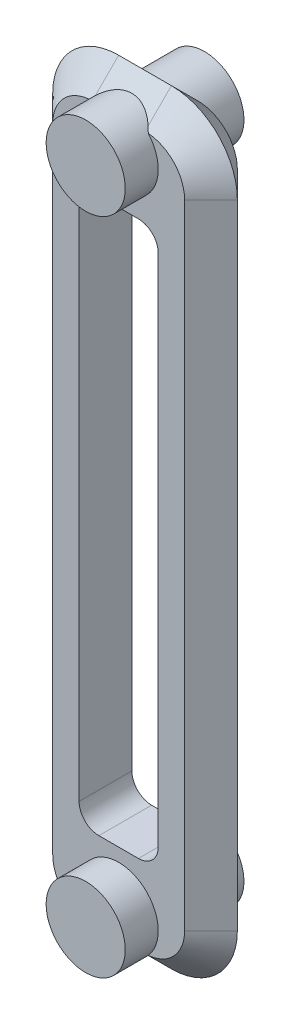
ISO-10303-21;
HEADER;
FILE_DESCRIPTION(('STEP AP214'),'2;1');
FILE_NAME('part.step','',(''),(''),'','','');
FILE_SCHEMA(('AUTOMOTIVE_DESIGN { 1 0 10303 214 1 1 1 1 }'));
ENDSEC;
DATA;
#1=APPLICATION_CONTEXT('core data for automotive mechanical design processes');
#2=APPLICATION_PROTOCOL_DEFINITION('international standard','automotive_design',2000,#1);
#3=PRODUCT_CONTEXT('',#1,'mechanical');
#4=PRODUCT('Part','Part','',(#3));
#5=PRODUCT_RELATED_PRODUCT_CATEGORY('part','',(#4));
#6=PRODUCT_DEFINITION_FORMATION('','',#4);
#7=PRODUCT_DEFINITION_CONTEXT('part definition',#1,'design');
#8=PRODUCT_DEFINITION('design','',#6,#7);
#9=PRODUCT_DEFINITION_SHAPE('','',#8);
#10=(LENGTH_UNIT() NAMED_UNIT(*) SI_UNIT(.MILLI.,.METRE.));
#11=(NAMED_UNIT(*) PLANE_ANGLE_UNIT() SI_UNIT($,.RADIAN.));
#12=(NAMED_UNIT(*) SI_UNIT($,.STERADIAN.) SOLID_ANGLE_UNIT());
#13=UNCERTAINTY_MEASURE_WITH_UNIT(LENGTH_MEASURE(1.E-05),#10,'distance_accuracy_value','');
#14=(GEOMETRIC_REPRESENTATION_CONTEXT(3) GLOBAL_UNCERTAINTY_ASSIGNED_CONTEXT((#13)) GLOBAL_UNIT_ASSIGNED_CONTEXT((#10,
#11,#12)) REPRESENTATION_CONTEXT('',''));
#15=CARTESIAN_POINT('',(0.,0.,0.));
#16=DIRECTION('',(0.,0.,1.));
#17=DIRECTION('',(1.,0.,0.));
#18=AXIS2_PLACEMENT_3D('',#15,#16,#17);
#19=CARTESIAN_POINT('',(0.,0.,-20.));
#20=DIRECTION('',(0.,0.,-1.));
#21=DIRECTION('',(-1.,0.,0.));
#22=AXIS2_PLACEMENT_3D('',#19,#20,#21);
#23=PLANE('',#22);
#24=CARTESIAN_POINT('',(0.,-458.783389552814,-20.));
#25=DIRECTION('',(0.,0.,-1.));
#26=DIRECTION('',(-1.,0.,0.));
#27=AXIS2_PLACEMENT_3D('',#24,#25,#26);
#28=CIRCLE('',#27,30.);
#29=CARTESIAN_POINT('',(-22.4498995979889,-478.683188748791,-20.));
#30=VERTEX_POINT('',#29);
#31=CARTESIAN_POINT('',(22.4498995979889,-478.683188748791,-20.));
#32=VERTEX_POINT('',#31);
#33=EDGE_CURVE('E494',#30,#32,#28,.T.);
#34=ORIENTED_EDGE('',*,*,#33,.F.);
#35=CARTESIAN_POINT('',(-20.,-448.783389552814,-20.));
#36=DIRECTION('',(0.,0.,-1.));
#37=DIRECTION('',(-1.,0.,0.));
#38=AXIS2_PLACEMENT_3D('',#35,#36,#37);
#39=CIRCLE('',#38,29.9999999999999);
#40=CARTESIAN_POINT('',(-49.9999999999999,-448.783389552814,-20.));
#41=VERTEX_POINT('',#40);
#42=EDGE_CURVE('E555',#30,#41,#39,.T.);
#43=ORIENTED_EDGE('',*,*,#42,.T.);
#44=DIRECTION('',(0.,1.,0.));
#45=VECTOR('',#44,1.);
#46=CARTESIAN_POINT('',(-49.9999999999999,31.2166104471865,-20.));
#47=LINE('',#46,#45);
#48=CARTESIAN_POINT('',(-49.9999999999999,31.2166104471865,-20.));
#49=VERTEX_POINT('',#48);
#50=EDGE_CURVE('E553',#41,#49,#47,.T.);
#51=ORIENTED_EDGE('',*,*,#50,.T.);
#52=CARTESIAN_POINT('',(-20.,31.2166104471865,-20.));
#53=DIRECTION('',(0.,0.,-1.));
#54=DIRECTION('',(-1.,0.,0.));
#55=AXIS2_PLACEMENT_3D('',#52,#53,#54);
#56=CIRCLE('',#55,29.9999999999999);
#57=CARTESIAN_POINT('',(-22.4498995979889,61.1164096431638,-20.));
#58=VERTEX_POINT('',#57);
#59=EDGE_CURVE('E551',#49,#58,#56,.T.);
#60=ORIENTED_EDGE('',*,*,#59,.T.);
#61=CARTESIAN_POINT('',(0.,41.2166104471865,-20.));
#62=DIRECTION('',(0.,0.,-1.));
#63=DIRECTION('',(-1.,0.,0.));
#64=AXIS2_PLACEMENT_3D('',#61,#62,#63);
#65=CIRCLE('',#64,30.);
#66=CARTESIAN_POINT('',(22.4498995979889,61.1164096431638,-20.));
#67=VERTEX_POINT('',#66);
#68=EDGE_CURVE('E503',#67,#58,#65,.T.);
#69=ORIENTED_EDGE('',*,*,#68,.F.);
#70=CARTESIAN_POINT('',(20.,31.2166104471865,-20.));
#71=DIRECTION('',(0.,0.,-1.));
#72=DIRECTION('',(-1.,0.,0.));
#73=AXIS2_PLACEMENT_3D('',#70,#71,#72);
#74=CIRCLE('',#73,29.9999999999999);
#75=CARTESIAN_POINT('',(49.9999999999999,31.2166104471865,-20.));
#76=VERTEX_POINT('',#75);
#77=EDGE_CURVE('E545',#67,#76,#74,.T.);
#78=ORIENTED_EDGE('',*,*,#77,.T.);
#79=DIRECTION('',(0.,-1.,0.));
#80=VECTOR('',#79,1.);
#81=CARTESIAN_POINT('',(49.9999999999999,-448.783389552814,-20.));
#82=LINE('',#81,#80);
#83=CARTESIAN_POINT('',(49.9999999999999,-448.783389552814,-20.));
#84=VERTEX_POINT('',#83);
#85=EDGE_CURVE('E547',#76,#84,#82,.T.);
#86=ORIENTED_EDGE('',*,*,#85,.T.);
#87=CARTESIAN_POINT('',(20.,-448.783389552814,-20.));
#88=DIRECTION('',(0.,0.,-1.));
#89=DIRECTION('',(-1.,0.,0.));
#90=AXIS2_PLACEMENT_3D('',#87,#88,#89);
#91=CIRCLE('',#90,29.9999999999999);
#92=EDGE_CURVE('E549',#84,#32,#91,.T.);
#93=ORIENTED_EDGE('',*,*,#92,.T.);
#94=EDGE_LOOP('',(#34,#43,#51,#60,#69,#78,#86,#93));
#95=FACE_BOUND('',#94,.T.);
#96=DIRECTION('',(1.,0.,0.));
#97=VECTOR('',#96,1.);
#98=CARTESIAN_POINT('',(0.,-418.783389552813,-20.));
#99=LINE('',#98,#97);
#100=CARTESIAN_POINT('',(-15.,-418.783389552813,-20.));
#101=VERTEX_POINT('',#100);
#102=CARTESIAN_POINT('',(15.,-418.783389552813,-20.));
#103=VERTEX_POINT('',#102);
#104=EDGE_CURVE('E477',#101,#103,#99,.T.);
#105=ORIENTED_EDGE('',*,*,#104,.T.);
#106=CARTESIAN_POINT('',(15.,-403.783389552813,-20.));
#107=DIRECTION('',(0.,0.,-1.));
#108=DIRECTION('',(-1.,0.,0.));
#109=AXIS2_PLACEMENT_3D('',#106,#107,#108);
#110=CIRCLE('',#109,15.);
#111=CARTESIAN_POINT('',(30.,-403.783389552813,-20.));
#112=VERTEX_POINT('',#111);
#113=EDGE_CURVE('E534',#103,#112,#110,.F.);
#114=ORIENTED_EDGE('',*,*,#113,.T.);
#115=DIRECTION('',(0.,1.,0.));
#116=VECTOR('',#115,1.);
#117=CARTESIAN_POINT('',(30.,0.,-20.));
#118=LINE('',#117,#116);
#119=CARTESIAN_POINT('',(30.,-13.7833895528135,-20.));
#120=VERTEX_POINT('',#119);
#121=EDGE_CURVE('E473',#112,#120,#118,.T.);
#122=ORIENTED_EDGE('',*,*,#121,.T.);
#123=CARTESIAN_POINT('',(15.,-13.7833895528135,-20.));
#124=DIRECTION('',(0.,0.,-1.));
#125=DIRECTION('',(-1.,0.,0.));
#126=AXIS2_PLACEMENT_3D('',#123,#124,#125);
#127=CIRCLE('',#126,15.);
#128=CARTESIAN_POINT('',(15.,1.21661044718652,-20.));
#129=VERTEX_POINT('',#128);
#130=EDGE_CURVE('E538',#120,#129,#127,.F.);
#131=ORIENTED_EDGE('',*,*,#130,.T.);
#132=DIRECTION('',(-1.,0.,0.));
#133=VECTOR('',#132,1.);
#134=CARTESIAN_POINT('',(0.,1.21661044718652,-20.));
#135=LINE('',#134,#133);
#136=CARTESIAN_POINT('',(-15.,1.21661044718652,-20.));
#137=VERTEX_POINT('',#136);
#138=EDGE_CURVE('E470',#129,#137,#135,.T.);
#139=ORIENTED_EDGE('',*,*,#138,.T.);
#140=CARTESIAN_POINT('',(-15.,-13.7833895528135,-20.));
#141=DIRECTION('',(0.,0.,-1.));
#142=DIRECTION('',(-1.,0.,0.));
#143=AXIS2_PLACEMENT_3D('',#140,#141,#142);
#144=CIRCLE('',#143,15.);
#145=CARTESIAN_POINT('',(-30.,-13.7833895528135,-20.));
#146=VERTEX_POINT('',#145);
#147=EDGE_CURVE('E150',#137,#146,#144,.F.);
#148=ORIENTED_EDGE('',*,*,#147,.T.);
#149=DIRECTION('',(0.,-1.,0.));
#150=VECTOR('',#149,1.);
#151=CARTESIAN_POINT('',(-30.,0.,-20.));
#152=LINE('',#151,#150);
#153=CARTESIAN_POINT('',(-30.,-403.783389552813,-20.));
#154=VERTEX_POINT('',#153);
#155=EDGE_CURVE('E485',#146,#154,#152,.T.);
#156=ORIENTED_EDGE('',*,*,#155,.T.);
#157=CARTESIAN_POINT('',(-15.,-403.783389552813,-20.));
#158=DIRECTION('',(0.,0.,-1.));
#159=DIRECTION('',(-1.,0.,0.));
#160=AXIS2_PLACEMENT_3D('',#157,#158,#159);
#161=CIRCLE('',#160,15.);
#162=EDGE_CURVE('E530',#154,#101,#161,.F.);
#163=ORIENTED_EDGE('',*,*,#162,.T.);
#164=EDGE_LOOP('',(#105,#114,#122,#131,#139,#148,#156,#163));
#165=FACE_BOUND('',#164,.T.);
#166=ADVANCED_FACE('F94',(#95,#165),#23,.T.);
#167=CARTESIAN_POINT('',(0.,0.,20.));
#168=DIRECTION('',(0.,0.,-1.));
#169=DIRECTION('',(-1.,0.,0.));
#170=AXIS2_PLACEMENT_3D('',#167,#168,#169);
#171=PLANE('',#170);
#172=CARTESIAN_POINT('',(0.,-458.783389552814,20.));
#173=DIRECTION('',(0.,0.,1.));
#174=DIRECTION('',(1.,0.,0.));
#175=AXIS2_PLACEMENT_3D('',#172,#173,#174);
#176=CIRCLE('',#175,30.);
#177=CARTESIAN_POINT('',(22.4498995979891,-478.683188748791,20.));
#178=VERTEX_POINT('',#177);
#179=CARTESIAN_POINT('',(-22.4498995979891,-478.683188748791,20.));
#180=VERTEX_POINT('',#179);
#181=EDGE_CURVE('E269',#178,#180,#176,.T.);
#182=ORIENTED_EDGE('',*,*,#181,.F.);
#183=CARTESIAN_POINT('',(20.,-448.783389552814,20.));
#184=DIRECTION('',(0.,0.,-1.));
#185=DIRECTION('',(-1.,0.,0.));
#186=AXIS2_PLACEMENT_3D('',#183,#184,#185);
#187=CIRCLE('',#186,29.9999999999997);
#188=CARTESIAN_POINT('',(49.9999999999997,-448.783389552814,20.));
#189=VERTEX_POINT('',#188);
#190=EDGE_CURVE('E567',#178,#189,#187,.F.);
#191=ORIENTED_EDGE('',*,*,#190,.T.);
#192=DIRECTION('',(0.,1.,0.));
#193=VECTOR('',#192,1.);
#194=CARTESIAN_POINT('',(49.9999999999997,0.,20.));
#195=LINE('',#194,#193);
#196=CARTESIAN_POINT('',(49.9999999999997,31.2166104471865,20.));
#197=VERTEX_POINT('',#196);
#198=EDGE_CURVE('E565',#189,#197,#195,.T.);
#199=ORIENTED_EDGE('',*,*,#198,.T.);
#200=CARTESIAN_POINT('',(20.,31.2166104471865,20.));
#201=DIRECTION('',(0.,0.,-1.));
#202=DIRECTION('',(-1.,0.,0.));
#203=AXIS2_PLACEMENT_3D('',#200,#201,#202);
#204=CIRCLE('',#203,29.9999999999997);
#205=CARTESIAN_POINT('',(22.4498995979891,61.1164096431636,20.));
#206=VERTEX_POINT('',#205);
#207=EDGE_CURVE('E563',#197,#206,#204,.F.);
#208=ORIENTED_EDGE('',*,*,#207,.T.);
#209=CARTESIAN_POINT('',(0.,41.2166104471865,20.));
#210=DIRECTION('',(0.,0.,1.));
#211=DIRECTION('',(1.,0.,0.));
#212=AXIS2_PLACEMENT_3D('',#209,#210,#211);
#213=CIRCLE('',#212,30.);
#214=CARTESIAN_POINT('',(-22.4498995979891,61.1164096431636,20.));
#215=VERTEX_POINT('',#214);
#216=EDGE_CURVE('E507',#215,#206,#213,.T.);
#217=ORIENTED_EDGE('',*,*,#216,.F.);
#218=CARTESIAN_POINT('',(-20.,31.2166104471865,20.));
#219=DIRECTION('',(0.,0.,-1.));
#220=DIRECTION('',(-1.,0.,0.));
#221=AXIS2_PLACEMENT_3D('',#218,#219,#220);
#222=CIRCLE('',#221,29.9999999999997);
#223=CARTESIAN_POINT('',(-49.9999999999997,31.2166104471865,20.));
#224=VERTEX_POINT('',#223);
#225=EDGE_CURVE('E557',#215,#224,#222,.F.);
#226=ORIENTED_EDGE('',*,*,#225,.T.);
#227=DIRECTION('',(0.,-1.,0.));
#228=VECTOR('',#227,1.);
#229=CARTESIAN_POINT('',(-49.9999999999997,0.,20.));
#230=LINE('',#229,#228);
#231=CARTESIAN_POINT('',(-49.9999999999997,-448.783389552814,20.));
#232=VERTEX_POINT('',#231);
#233=EDGE_CURVE('E559',#224,#232,#230,.T.);
#234=ORIENTED_EDGE('',*,*,#233,.T.);
#235=CARTESIAN_POINT('',(-20.,-448.783389552814,20.));
#236=DIRECTION('',(0.,0.,-1.));
#237=DIRECTION('',(-1.,0.,0.));
#238=AXIS2_PLACEMENT_3D('',#235,#236,#237);
#239=CIRCLE('',#238,29.9999999999996);
#240=EDGE_CURVE('E561',#232,#180,#239,.F.);
#241=ORIENTED_EDGE('',*,*,#240,.T.);
#242=EDGE_LOOP('',(#182,#191,#199,#208,#217,#226,#234,#241));
#243=FACE_BOUND('',#242,.T.);
#244=DIRECTION('',(-1.,0.,0.));
#245=VECTOR('',#244,1.);
#246=CARTESIAN_POINT('',(0.,1.21661044718652,20.));
#247=LINE('',#246,#245);
#248=CARTESIAN_POINT('',(15.,1.21661044718652,20.));
#249=VERTEX_POINT('',#248);
#250=CARTESIAN_POINT('',(-15.,1.21661044718652,20.));
#251=VERTEX_POINT('',#250);
#252=EDGE_CURVE('E487',#249,#251,#247,.T.);
#253=ORIENTED_EDGE('',*,*,#252,.F.);
#254=CARTESIAN_POINT('',(15.,-13.7833895528135,20.));
#255=DIRECTION('',(0.,0.,-1.));
#256=DIRECTION('',(-1.,0.,0.));
#257=AXIS2_PLACEMENT_3D('',#254,#255,#256);
#258=CIRCLE('',#257,15.);
#259=CARTESIAN_POINT('',(30.,-13.7833895528135,20.));
#260=VERTEX_POINT('',#259);
#261=EDGE_CURVE('E540',#249,#260,#258,.T.);
#262=ORIENTED_EDGE('',*,*,#261,.T.);
#263=DIRECTION('',(0.,1.,0.));
#264=VECTOR('',#263,1.);
#265=CARTESIAN_POINT('',(30.,0.,20.));
#266=LINE('',#265,#264);
#267=CARTESIAN_POINT('',(30.,-403.783389552813,20.));
#268=VERTEX_POINT('',#267);
#269=EDGE_CURVE('E928',#268,#260,#266,.T.);
#270=ORIENTED_EDGE('',*,*,#269,.F.);
#271=CARTESIAN_POINT('',(15.,-403.783389552813,20.));
#272=DIRECTION('',(0.,0.,-1.));
#273=DIRECTION('',(-1.,0.,0.));
#274=AXIS2_PLACEMENT_3D('',#271,#272,#273);
#275=CIRCLE('',#274,15.);
#276=CARTESIAN_POINT('',(15.,-418.783389552813,20.));
#277=VERTEX_POINT('',#276);
#278=EDGE_CURVE('E536',#268,#277,#275,.T.);
#279=ORIENTED_EDGE('',*,*,#278,.T.);
#280=DIRECTION('',(1.,0.,0.));
#281=VECTOR('',#280,1.);
#282=CARTESIAN_POINT('',(0.,-418.783389552813,20.));
#283=LINE('',#282,#281);
#284=CARTESIAN_POINT('',(-15.,-418.783389552813,20.));
#285=VERTEX_POINT('',#284);
#286=EDGE_CURVE('E940',#285,#277,#283,.T.);
#287=ORIENTED_EDGE('',*,*,#286,.F.);
#288=CARTESIAN_POINT('',(-15.,-403.783389552813,20.));
#289=DIRECTION('',(0.,0.,-1.));
#290=DIRECTION('',(-1.,0.,0.));
#291=AXIS2_PLACEMENT_3D('',#288,#289,#290);
#292=CIRCLE('',#291,15.);
#293=CARTESIAN_POINT('',(-30.,-403.783389552813,20.));
#294=VERTEX_POINT('',#293);
#295=EDGE_CURVE('E532',#285,#294,#292,.T.);
#296=ORIENTED_EDGE('',*,*,#295,.T.);
#297=DIRECTION('',(0.,-1.,0.));
#298=VECTOR('',#297,1.);
#299=CARTESIAN_POINT('',(-30.,0.,20.));
#300=LINE('',#299,#298);
#301=CARTESIAN_POINT('',(-30.,-13.7833895528135,20.));
#302=VERTEX_POINT('',#301);
#303=EDGE_CURVE('E480',#302,#294,#300,.T.);
#304=ORIENTED_EDGE('',*,*,#303,.F.);
#305=CARTESIAN_POINT('',(-15.,-13.7833895528135,20.));
#306=DIRECTION('',(0.,0.,-1.));
#307=DIRECTION('',(-1.,0.,0.));
#308=AXIS2_PLACEMENT_3D('',#305,#306,#307);
#309=CIRCLE('',#308,15.);
#310=EDGE_CURVE('E543',#302,#251,#309,.T.);
#311=ORIENTED_EDGE('',*,*,#310,.T.);
#312=EDGE_LOOP('',(#253,#262,#270,#279,#287,#296,#304,#311));
#313=FACE_BOUND('',#312,.T.);
#314=ADVANCED_FACE('F373',(#243,#313),#171,.F.);
#315=CARTESIAN_POINT('',(0.,41.2166104471865,45.));
#316=DIRECTION('',(0.,0.,-1.));
#317=DIRECTION('',(-1.,0.,0.));
#318=AXIS2_PLACEMENT_3D('',#315,#316,#317);
#319=PLANE('',#318);
#320=CARTESIAN_POINT('',(0.,41.2166104471865,45.));
#321=DIRECTION('',(0.,0.,-1.));
#322=DIRECTION('',(-1.,0.,0.));
#323=AXIS2_PLACEMENT_3D('',#320,#321,#322);
#324=CIRCLE('',#323,30.);
#325=CARTESIAN_POINT('',(-30.,41.2166104471865,45.));
#326=VERTEX_POINT('',#325);
#327=EDGE_CURVE('E500',#326,#326,#324,.T.);
#328=ORIENTED_EDGE('',*,*,#327,.F.);
#329=EDGE_LOOP('',(#328));
#330=FACE_BOUND('',#329,.T.);
#331=ADVANCED_FACE('F379',(#330),#319,.F.);
#332=CARTESIAN_POINT('',(0.,41.2166104471865,45.));
#333=DIRECTION('',(0.,0.,-1.));
#334=DIRECTION('',(-1.,0.,0.));
#335=AXIS2_PLACEMENT_3D('',#332,#333,#334);
#336=CYLINDRICAL_SURFACE('',#335,30.);
#337=ORIENTED_EDGE('',*,*,#327,.T.);
#338=EDGE_LOOP('',(#337));
#339=FACE_BOUND('',#338,.T.);
#340=CARTESIAN_POINT('',(22.4498995979891,61.1164096431636,20.));
#341=CARTESIAN_POINT('',(22.2588779635971,61.3319109296127,19.8008178010276));
#342=CARTESIAN_POINT('',(22.0644933278189,61.5449534858444,19.6021982180622));
#343=CARTESIAN_POINT('',(21.6692082579715,61.9657958840661,19.2062581488737));
#344=CARTESIAN_POINT('',(21.4683117448903,62.1735987517579,19.0089369639024));
#345=CARTESIAN_POINT('',(21.0599858906984,62.5838929599514,18.6155307991166));
#346=CARTESIAN_POINT('',(20.8525565145246,62.7863842719343,18.4194458259438));
#347=CARTESIAN_POINT('',(20.4311432071252,63.1859700238539,18.0284546150434));
#348=CARTESIAN_POINT('',(20.2171554702689,63.3830611996358,17.8335491434074));
#349=CARTESIAN_POINT('',(20.,63.5772902221844,17.6393202250018));
#350=B_SPLINE_CURVE_WITH_KNOTS('',3,(#340,#341,#342,#343,#344,#345,#346,#347,#348,#349),
.UNSPECIFIED.,.F.,.F.,(4,2,2,2,4),(0.,1.05042075361132,2.10022035721551,3.15002559624489,
4.20045199228863),.UNSPECIFIED.);
#351=CARTESIAN_POINT('',(20.,63.5772902221844,17.6393202250018));
#352=VERTEX_POINT('',#351);
#353=EDGE_CURVE('E272',#206,#352,#350,.T.);
#354=ORIENTED_EDGE('',*,*,#353,.T.);
#355=CARTESIAN_POINT('',(0.,41.2166104471865,39.9999999999994));
#356=DIRECTION('',(0.,0.707106781186544,0.707106781186551));
#357=DIRECTION('',(0.,0.707106781186551,-0.707106781186544));
#358=AXIS2_PLACEMENT_3D('',#355,#356,#357);
#359=ELLIPSE('',#358,42.4264068711926,30.);
#360=CARTESIAN_POINT('',(-20.,63.5772902221844,17.6393202250018));
#361=VERTEX_POINT('',#360);
#362=EDGE_CURVE('E12',#352,#361,#359,.T.);
#363=ORIENTED_EDGE('',*,*,#362,.T.);
#364=CARTESIAN_POINT('',(-20.,63.5772902221844,17.6393202250018));
#365=CARTESIAN_POINT('',(-20.2171554702689,63.3830611996358,17.8335491434074));
#366=CARTESIAN_POINT('',(-20.4311432071252,63.1859700238539,18.0284546150434));
#367=CARTESIAN_POINT('',(-20.8525565145246,62.7863842719343,18.4194458259438));
#368=CARTESIAN_POINT('',(-21.0599858906984,62.5838929599514,18.6155307991166));
#369=CARTESIAN_POINT('',(-21.4683117448903,62.1735987517579,19.0089369639024));
#370=CARTESIAN_POINT('',(-21.6692082579715,61.9657958840661,19.2062581488737));
#371=CARTESIAN_POINT('',(-22.0644933278189,61.5449534858444,19.6021982180622));
#372=CARTESIAN_POINT('',(-22.2588779635971,61.3319109296127,19.8008178010276));
#373=CARTESIAN_POINT('',(-22.4498995979891,61.1164096431636,20.));
#374=B_SPLINE_CURVE_WITH_KNOTS('',3,(#364,#365,#366,#367,#368,#369,#370,#371,#372,#373),
.UNSPECIFIED.,.F.,.F.,(4,2,2,2,4),(0.,1.05042639604373,2.10023163507312,3.1500312386773,
4.20045199228863),.UNSPECIFIED.);
#375=EDGE_CURVE('E104',#361,#215,#374,.T.);
#376=ORIENTED_EDGE('',*,*,#375,.T.);
#377=ORIENTED_EDGE('',*,*,#216,.T.);
#378=EDGE_LOOP('',(#354,#363,#376,#377));
#379=FACE_BOUND('',#378,.T.);
#380=ADVANCED_FACE('F594',(#339,#379),#336,.T.);
#381=CARTESIAN_POINT('',(-22.4498995979889,61.1164096431638,-20.));
#382=CARTESIAN_POINT('',(-22.2588779635969,61.3319109296129,-19.8008178010276));
#383=CARTESIAN_POINT('',(-22.0644933278187,61.5449534858445,-19.6021982180622));
#384=CARTESIAN_POINT('',(-21.6692082579714,61.9657958840662,-19.2062581488737));
#385=CARTESIAN_POINT('',(-21.4683117448902,62.173598751758,-19.0089369639025));
#386=CARTESIAN_POINT('',(-21.0599858906983,62.5838929599515,-18.6155307991167));
#387=CARTESIAN_POINT('',(-20.8525565145245,62.7863842719344,-18.4194458259439));
#388=CARTESIAN_POINT('',(-20.4311432071252,63.185970023854,-18.0284546150435));
#389=CARTESIAN_POINT('',(-20.2171554702688,63.3830611996359,-17.8335491434075));
#390=CARTESIAN_POINT('',(-20.,63.5772902221844,-17.6393202250019));
#391=B_SPLINE_CURVE_WITH_KNOTS('',3,(#381,#382,#383,#384,#385,#386,#387,#388,#389,#390),
.UNSPECIFIED.,.F.,.F.,(4,2,2,2,4),(0.,1.05042075361125,2.10022035721535,3.15002559624465,
4.20045199228831),.UNSPECIFIED.);
#392=CARTESIAN_POINT('',(-20.,63.5772902221844,-17.6393202250019));
#393=VERTEX_POINT('',#392);
#394=EDGE_CURVE('E341',#58,#393,#391,.T.);
#395=ORIENTED_EDGE('',*,*,#394,.T.);
#396=CARTESIAN_POINT('',(0.,41.2166104471865,-40.0000000000001));
#397=DIRECTION('',(0.,-0.707106781186551,0.707106781186544));
#398=DIRECTION('',(0.,-0.707106781186544,-0.707106781186551));
#399=AXIS2_PLACEMENT_3D('',#396,#397,#398);
#400=ELLIPSE('',#399,42.4264068711931,30.);
#401=CARTESIAN_POINT('',(20.,63.5772902221844,-17.639320225002));
#402=VERTEX_POINT('',#401);
#403=EDGE_CURVE('E289',#393,#402,#400,.F.);
#404=ORIENTED_EDGE('',*,*,#403,.T.);
#405=CARTESIAN_POINT('',(20.,63.5772902221844,-17.639320225002));
#406=CARTESIAN_POINT('',(20.2171554702688,63.3830611996358,-17.8335491434075));
#407=CARTESIAN_POINT('',(20.4311432071252,63.185970023854,-18.0284546150435));
#408=CARTESIAN_POINT('',(20.8525565145245,62.7863842719344,-18.4194458259439));
#409=CARTESIAN_POINT('',(21.0599858906983,62.5838929599515,-18.6155307991167));
#410=CARTESIAN_POINT('',(21.4683117448902,62.173598751758,-19.0089369639025));
#411=CARTESIAN_POINT('',(21.6692082579714,61.9657958840662,-19.2062581488737));
#412=CARTESIAN_POINT('',(22.0644933278187,61.5449534858445,-19.6021982180622));
#413=CARTESIAN_POINT('',(22.2588779635969,61.3319109296129,-19.8008178010276));
#414=CARTESIAN_POINT('',(22.4498995979889,61.1164096431638,-20.));
#415=B_SPLINE_CURVE_WITH_KNOTS('',3,(#405,#406,#407,#408,#409,#410,#411,#412,#413,#414),
.UNSPECIFIED.,.F.,.F.,(4,2,2,2,4),(0.,1.05042639604366,2.10023163507295,3.15003123867705,
4.20045199228828),.UNSPECIFIED.);
#416=EDGE_CURVE('E292',#402,#67,#415,.T.);
#417=ORIENTED_EDGE('',*,*,#416,.T.);
#418=ORIENTED_EDGE('',*,*,#68,.T.);
#419=EDGE_LOOP('',(#395,#404,#417,#418));
#420=FACE_BOUND('',#419,.T.);
#421=CARTESIAN_POINT('',(0.,41.2166104471865,-45.));
#422=DIRECTION('',(0.,0.,-1.));
#423=DIRECTION('',(-1.,0.,0.));
#424=AXIS2_PLACEMENT_3D('',#421,#422,#423);
#425=CIRCLE('',#424,30.);
#426=CARTESIAN_POINT('',(-30.,41.2166104471865,-45.));
#427=VERTEX_POINT('',#426);
#428=EDGE_CURVE('E497',#427,#427,#425,.T.);
#429=ORIENTED_EDGE('',*,*,#428,.F.);
#430=EDGE_LOOP('',(#429));
#431=FACE_BOUND('',#430,.T.);
#432=ADVANCED_FACE('F591',(#420,#431),#336,.T.);
#433=CARTESIAN_POINT('',(0.,41.2166104471865,-45.));
#434=DIRECTION('',(0.,0.,-1.));
#435=DIRECTION('',(-1.,0.,0.));
#436=AXIS2_PLACEMENT_3D('',#433,#434,#435);
#437=PLANE('',#436);
#438=ORIENTED_EDGE('',*,*,#428,.T.);
#439=EDGE_LOOP('',(#438));
#440=FACE_BOUND('',#439,.T.);
#441=ADVANCED_FACE('F320',(#440),#437,.T.);
#442=CARTESIAN_POINT('',(0.,-458.783389552814,45.));
#443=DIRECTION('',(0.,0.,-1.));
#444=DIRECTION('',(-1.,0.,0.));
#445=AXIS2_PLACEMENT_3D('',#442,#443,#444);
#446=PLANE('',#445);
#447=CARTESIAN_POINT('',(0.,-458.783389552814,45.));
#448=DIRECTION('',(0.,0.,-1.));
#449=DIRECTION('',(-1.,0.,0.));
#450=AXIS2_PLACEMENT_3D('',#447,#448,#449);
#451=CIRCLE('',#450,30.);
#452=CARTESIAN_POINT('',(-30.,-458.783389552814,45.));
#453=VERTEX_POINT('',#452);
#454=EDGE_CURVE('E491',#453,#453,#451,.T.);
#455=ORIENTED_EDGE('',*,*,#454,.F.);
#456=EDGE_LOOP('',(#455));
#457=FACE_BOUND('',#456,.T.);
#458=ADVANCED_FACE('F318',(#457),#446,.F.);
#459=CARTESIAN_POINT('',(0.,-458.783389552814,45.));
#460=DIRECTION('',(0.,0.,-1.));
#461=DIRECTION('',(-1.,0.,0.));
#462=AXIS2_PLACEMENT_3D('',#459,#460,#461);
#463=CYLINDRICAL_SURFACE('',#462,30.);
#464=ORIENTED_EDGE('',*,*,#181,.T.);
#465=CARTESIAN_POINT('',(-22.4498995979891,-478.683188748791,20.));
#466=CARTESIAN_POINT('',(-22.2588779635971,-478.89869003524,19.8008178010276));
#467=CARTESIAN_POINT('',(-22.0644933278189,-479.111732591471,19.6021982180622));
#468=CARTESIAN_POINT('',(-21.6692082579716,-479.532574989693,19.2062581488737));
#469=CARTESIAN_POINT('',(-21.4683117448904,-479.740377857385,19.0089369639024));
#470=CARTESIAN_POINT('',(-21.0599858906984,-480.150672065578,18.6155307991166));
#471=CARTESIAN_POINT('',(-20.8525565145247,-480.353163377561,18.4194458259438));
#472=CARTESIAN_POINT('',(-20.4311432071252,-480.752749129481,18.0284546150433));
#473=CARTESIAN_POINT('',(-20.2171554702689,-480.949840305263,17.8335491434074));
#474=CARTESIAN_POINT('',(-20.,-481.144069327811,17.6393202250017));
#475=B_SPLINE_CURVE_WITH_KNOTS('',3,(#465,#466,#467,#468,#469,#470,#471,#472,#473,#474),
.UNSPECIFIED.,.F.,.F.,(4,2,2,2,4),(0.,1.05042075361134,2.10022035721554,3.15002559624491,
4.2004519922887),.UNSPECIFIED.);
#476=CARTESIAN_POINT('',(-20.,-481.144069327811,17.6393202250017));
#477=VERTEX_POINT('',#476);
#478=EDGE_CURVE('E262',#180,#477,#475,.T.);
#479=ORIENTED_EDGE('',*,*,#478,.T.);
#480=CARTESIAN_POINT('',(0.,-458.783389552814,39.9999999999994));
#481=DIRECTION('',(0.,0.707106781186544,-0.707106781186551));
#482=DIRECTION('',(0.,-0.707106781186551,-0.707106781186544));
#483=AXIS2_PLACEMENT_3D('',#480,#481,#482);
#484=ELLIPSE('',#483,42.4264068711927,30.);
#485=CARTESIAN_POINT('',(20.,-481.144069327811,17.6393202250017));
#486=VERTEX_POINT('',#485);
#487=EDGE_CURVE('E267',#477,#486,#484,.F.);
#488=ORIENTED_EDGE('',*,*,#487,.T.);
#489=CARTESIAN_POINT('',(20.,-481.144069327811,17.6393202250017));
#490=CARTESIAN_POINT('',(20.2171554702689,-480.949840305263,17.8335491434074));
#491=CARTESIAN_POINT('',(20.4311432071252,-480.752749129481,18.0284546150433));
#492=CARTESIAN_POINT('',(20.8525565145246,-480.353163377561,18.4194458259438));
#493=CARTESIAN_POINT('',(21.0599858906984,-480.150672065578,18.6155307991166));
#494=CARTESIAN_POINT('',(21.4683117448904,-479.740377857385,19.0089369639024));
#495=CARTESIAN_POINT('',(21.6692082579715,-479.532574989693,19.2062581488737));
#496=CARTESIAN_POINT('',(22.0644933278189,-479.111732591471,19.6021982180622));
#497=CARTESIAN_POINT('',(22.2588779635971,-478.89869003524,19.8008178010276));
#498=CARTESIAN_POINT('',(22.4498995979891,-478.683188748791,20.));
#499=B_SPLINE_CURVE_WITH_KNOTS('',3,(#489,#490,#491,#492,#493,#494,#495,#496,#497,#498),
.UNSPECIFIED.,.F.,.F.,(4,2,2,2,4),(0.,1.05042639604379,2.10023163507315,3.15003123867735,
4.20045199228868),.UNSPECIFIED.);
#500=EDGE_CURVE('E273',#486,#178,#499,.T.);
#501=ORIENTED_EDGE('',*,*,#500,.T.);
#502=EDGE_LOOP('',(#464,#479,#488,#501));
#503=FACE_BOUND('',#502,.T.);
#504=ORIENTED_EDGE('',*,*,#454,.T.);
#505=EDGE_LOOP('',(#504));
#506=FACE_BOUND('',#505,.T.);
#507=ADVANCED_FACE('F264',(#503,#506),#463,.T.);
#508=ORIENTED_EDGE('',*,*,#33,.T.);
#509=CARTESIAN_POINT('',(22.4498995979889,-478.683188748791,-20.));
#510=CARTESIAN_POINT('',(22.258877963597,-478.89869003524,-19.8008178010276));
#511=CARTESIAN_POINT('',(22.0644933278187,-479.111732591472,-19.6021982180622));
#512=CARTESIAN_POINT('',(21.6692082579714,-479.532574989693,-19.2062581488737));
#513=CARTESIAN_POINT('',(21.4683117448902,-479.740377857385,-19.0089369639024));
#514=CARTESIAN_POINT('',(21.0599858906983,-480.150672065578,-18.6155307991167));
#515=CARTESIAN_POINT('',(20.8525565145246,-480.353163377561,-18.4194458259439));
#516=CARTESIAN_POINT('',(20.4311432071252,-480.752749129481,-18.0284546150435));
#517=CARTESIAN_POINT('',(20.2171554702689,-480.949840305263,-17.8335491434075));
#518=CARTESIAN_POINT('',(20.,-481.144069327811,-17.6393202250019));
#519=B_SPLINE_CURVE_WITH_KNOTS('',3,(#509,#510,#511,#512,#513,#514,#515,#516,#517,#518),
.UNSPECIFIED.,.F.,.F.,(4,2,2,2,4),(0.,1.05042075361131,2.10022035721537,3.15002559624467,
4.20045199228833),.UNSPECIFIED.);
#520=CARTESIAN_POINT('',(20.,-481.144069327811,-17.6393202250019));
#521=VERTEX_POINT('',#520);
#522=EDGE_CURVE('E334',#32,#521,#519,.T.);
#523=ORIENTED_EDGE('',*,*,#522,.T.);
#524=CARTESIAN_POINT('',(0.,-458.783389552814,-40.0000000000001));
#525=DIRECTION('',(0.,-0.707106781186551,-0.707106781186544));
#526=DIRECTION('',(0.,0.707106781186544,-0.707106781186551));
#527=AXIS2_PLACEMENT_3D('',#524,#525,#526);
#528=ELLIPSE('',#527,42.4264068711931,30.);
#529=CARTESIAN_POINT('',(-20.,-481.144069327811,-17.6393202250019));
#530=VERTEX_POINT('',#529);
#531=EDGE_CURVE('E414',#521,#530,#528,.T.);
#532=ORIENTED_EDGE('',*,*,#531,.T.);
#533=CARTESIAN_POINT('',(-20.,-481.144069327811,-17.6393202250019));
#534=CARTESIAN_POINT('',(-20.2171554702688,-480.949840305263,-17.8335491434075));
#535=CARTESIAN_POINT('',(-20.4311432071252,-480.752749129481,-18.0284546150435));
#536=CARTESIAN_POINT('',(-20.8525565145246,-480.353163377561,-18.4194458259439));
#537=CARTESIAN_POINT('',(-21.0599858906983,-480.150672065578,-18.6155307991167));
#538=CARTESIAN_POINT('',(-21.4683117448902,-479.740377857385,-19.0089369639025));
#539=CARTESIAN_POINT('',(-21.6692082579714,-479.532574989693,-19.2062581488737));
#540=CARTESIAN_POINT('',(-22.0644933278187,-479.111732591471,-19.6021982180622));
#541=CARTESIAN_POINT('',(-22.258877963597,-478.89869003524,-19.8008178010276));
#542=CARTESIAN_POINT('',(-22.4498995979889,-478.683188748791,-20.));
#543=B_SPLINE_CURVE_WITH_KNOTS('',3,(#533,#534,#535,#536,#537,#538,#539,#540,#541,#542),
.UNSPECIFIED.,.F.,.F.,(4,2,2,2,4),(0.,1.05042639604367,2.10023163507298,3.1500312386771,
4.20045199228835),.UNSPECIFIED.);
#544=EDGE_CURVE('E325',#530,#30,#543,.T.);
#545=ORIENTED_EDGE('',*,*,#544,.T.);
#546=EDGE_LOOP('',(#508,#523,#532,#545));
#547=FACE_BOUND('',#546,.T.);
#548=CARTESIAN_POINT('',(0.,-458.783389552814,-45.));
#549=DIRECTION('',(0.,0.,-1.));
#550=DIRECTION('',(-1.,0.,0.));
#551=AXIS2_PLACEMENT_3D('',#548,#549,#550);
#552=CIRCLE('',#551,30.);
#553=CARTESIAN_POINT('',(-30.,-458.783389552814,-45.));
#554=VERTEX_POINT('',#553);
#555=EDGE_CURVE('E488',#554,#554,#552,.T.);
#556=ORIENTED_EDGE('',*,*,#555,.F.);
#557=EDGE_LOOP('',(#556));
#558=FACE_BOUND('',#557,.T.);
#559=ADVANCED_FACE('F311',(#547,#558),#463,.T.);
#560=CARTESIAN_POINT('',(0.,-458.783389552814,-45.));
#561=DIRECTION('',(0.,0.,-1.));
#562=DIRECTION('',(-1.,0.,0.));
#563=AXIS2_PLACEMENT_3D('',#560,#561,#562);
#564=PLANE('',#563);
#565=ORIENTED_EDGE('',*,*,#555,.T.);
#566=EDGE_LOOP('',(#565));
#567=FACE_BOUND('',#566,.T.);
#568=ADVANCED_FACE('F316',(#567),#564,.T.);
#569=CARTESIAN_POINT('',(0.,1.21661044718652,20.));
#570=DIRECTION('',(0.,-1.,0.));
#571=DIRECTION('',(0.,0.,-1.));
#572=AXIS2_PLACEMENT_3D('',#569,#570,#571);
#573=PLANE('',#572);
#574=ORIENTED_EDGE('',*,*,#138,.F.);
#575=DIRECTION('',(0.,0.,-1.));
#576=VECTOR('',#575,1.);
#577=CARTESIAN_POINT('',(15.,1.21661044718652,20.));
#578=LINE('',#577,#576);
#579=EDGE_CURVE('E528',#129,#249,#578,.F.);
#580=ORIENTED_EDGE('',*,*,#579,.T.);
#581=ORIENTED_EDGE('',*,*,#252,.T.);
#582=DIRECTION('',(0.,0.,-1.));
#583=VECTOR('',#582,1.);
#584=CARTESIAN_POINT('',(-15.,1.21661044718652,-20.));
#585=LINE('',#584,#583);
#586=EDGE_CURVE('E525',#251,#137,#585,.T.);
#587=ORIENTED_EDGE('',*,*,#586,.T.);
#588=EDGE_LOOP('',(#574,#580,#581,#587));
#589=FACE_BOUND('',#588,.T.);
#590=ADVANCED_FACE('F657',(#589),#573,.T.);
#591=CARTESIAN_POINT('',(-30.,0.,20.));
#592=DIRECTION('',(1.,0.,0.));
#593=DIRECTION('',(0.,0.,-1.));
#594=AXIS2_PLACEMENT_3D('',#591,#592,#593);
#595=PLANE('',#594);
#596=ORIENTED_EDGE('',*,*,#303,.T.);
#597=DIRECTION('',(0.,0.,-1.));
#598=VECTOR('',#597,1.);
#599=CARTESIAN_POINT('',(-30.,-403.783389552813,-20.));
#600=LINE('',#599,#598);
#601=EDGE_CURVE('E512',#294,#154,#600,.T.);
#602=ORIENTED_EDGE('',*,*,#601,.T.);
#603=ORIENTED_EDGE('',*,*,#155,.F.);
#604=DIRECTION('',(0.,0.,-1.));
#605=VECTOR('',#604,1.);
#606=CARTESIAN_POINT('',(-30.,-13.7833895528135,20.));
#607=LINE('',#606,#605);
#608=EDGE_CURVE('E510',#146,#302,#607,.F.);
#609=ORIENTED_EDGE('',*,*,#608,.T.);
#610=EDGE_LOOP('',(#596,#602,#603,#609));
#611=FACE_BOUND('',#610,.T.);
#612=ADVANCED_FACE('F664',(#611),#595,.T.);
#613=CARTESIAN_POINT('',(0.,-418.783389552813,20.));
#614=DIRECTION('',(0.,1.,0.));
#615=DIRECTION('',(0.,0.,1.));
#616=AXIS2_PLACEMENT_3D('',#613,#614,#615);
#617=PLANE('',#616);
#618=ORIENTED_EDGE('',*,*,#104,.F.);
#619=DIRECTION('',(0.,0.,-1.));
#620=VECTOR('',#619,1.);
#621=CARTESIAN_POINT('',(-15.,-418.783389552813,20.));
#622=LINE('',#621,#620);
#623=EDGE_CURVE('E518',#101,#285,#622,.F.);
#624=ORIENTED_EDGE('',*,*,#623,.T.);
#625=ORIENTED_EDGE('',*,*,#286,.T.);
#626=DIRECTION('',(0.,0.,-1.));
#627=VECTOR('',#626,1.);
#628=CARTESIAN_POINT('',(15.,-418.783389552813,-20.));
#629=LINE('',#628,#627);
#630=EDGE_CURVE('E515',#277,#103,#629,.T.);
#631=ORIENTED_EDGE('',*,*,#630,.T.);
#632=EDGE_LOOP('',(#618,#624,#625,#631));
#633=FACE_BOUND('',#632,.T.);
#634=ADVANCED_FACE('F672',(#633),#617,.T.);
#635=CARTESIAN_POINT('',(30.,0.,20.));
#636=DIRECTION('',(-1.,0.,0.));
#637=DIRECTION('',(0.,0.,1.));
#638=AXIS2_PLACEMENT_3D('',#635,#636,#637);
#639=PLANE('',#638);
#640=ORIENTED_EDGE('',*,*,#121,.F.);
#641=DIRECTION('',(0.,0.,-1.));
#642=VECTOR('',#641,1.);
#643=CARTESIAN_POINT('',(30.,-403.783389552813,20.));
#644=LINE('',#643,#642);
#645=EDGE_CURVE('E523',#112,#268,#644,.F.);
#646=ORIENTED_EDGE('',*,*,#645,.T.);
#647=ORIENTED_EDGE('',*,*,#269,.T.);
#648=DIRECTION('',(0.,0.,-1.));
#649=VECTOR('',#648,1.);
#650=CARTESIAN_POINT('',(30.,-13.7833895528135,-20.));
#651=LINE('',#650,#649);
#652=EDGE_CURVE('E520',#260,#120,#651,.T.);
#653=ORIENTED_EDGE('',*,*,#652,.T.);
#654=EDGE_LOOP('',(#640,#646,#647,#653));
#655=FACE_BOUND('',#654,.T.);
#656=ADVANCED_FACE('F388',(#655),#639,.T.);
#657=CARTESIAN_POINT('',(-15.,-403.783389552813,20.));
#658=DIRECTION('',(0.,0.,1.));
#659=DIRECTION('',(1.,0.,0.));
#660=AXIS2_PLACEMENT_3D('',#657,#658,#659);
#661=CYLINDRICAL_SURFACE('',#660,15.);
#662=ORIENTED_EDGE('',*,*,#295,.F.);
#663=ORIENTED_EDGE('',*,*,#623,.F.);
#664=ORIENTED_EDGE('',*,*,#162,.F.);
#665=ORIENTED_EDGE('',*,*,#601,.F.);
#666=EDGE_LOOP('',(#662,#663,#664,#665));
#667=FACE_BOUND('',#666,.T.);
#668=ADVANCED_FACE('F384',(#667),#661,.F.);
#669=CARTESIAN_POINT('',(15.,-403.783389552813,20.));
#670=DIRECTION('',(0.,0.,1.));
#671=DIRECTION('',(1.,0.,0.));
#672=AXIS2_PLACEMENT_3D('',#669,#670,#671);
#673=CYLINDRICAL_SURFACE('',#672,15.);
#674=ORIENTED_EDGE('',*,*,#278,.F.);
#675=ORIENTED_EDGE('',*,*,#645,.F.);
#676=ORIENTED_EDGE('',*,*,#113,.F.);
#677=ORIENTED_EDGE('',*,*,#630,.F.);
#678=EDGE_LOOP('',(#674,#675,#676,#677));
#679=FACE_BOUND('',#678,.T.);
#680=ADVANCED_FACE('F387',(#679),#673,.F.);
#681=CARTESIAN_POINT('',(15.,-13.7833895528135,20.));
#682=DIRECTION('',(0.,0.,1.));
#683=DIRECTION('',(1.,0.,0.));
#684=AXIS2_PLACEMENT_3D('',#681,#682,#683);
#685=CYLINDRICAL_SURFACE('',#684,15.);
#686=ORIENTED_EDGE('',*,*,#261,.F.);
#687=ORIENTED_EDGE('',*,*,#579,.F.);
#688=ORIENTED_EDGE('',*,*,#130,.F.);
#689=ORIENTED_EDGE('',*,*,#652,.F.);
#690=EDGE_LOOP('',(#686,#687,#688,#689));
#691=FACE_BOUND('',#690,.T.);
#692=ADVANCED_FACE('F392',(#691),#685,.F.);
#693=CARTESIAN_POINT('',(-15.,-13.7833895528135,20.));
#694=DIRECTION('',(0.,0.,1.));
#695=DIRECTION('',(1.,0.,0.));
#696=AXIS2_PLACEMENT_3D('',#693,#694,#695);
#697=CYLINDRICAL_SURFACE('',#696,15.);
#698=ORIENTED_EDGE('',*,*,#310,.F.);
#699=ORIENTED_EDGE('',*,*,#608,.F.);
#700=ORIENTED_EDGE('',*,*,#147,.F.);
#701=ORIENTED_EDGE('',*,*,#586,.F.);
#702=EDGE_LOOP('',(#698,#699,#700,#701));
#703=FACE_BOUND('',#702,.T.);
#704=ADVANCED_FACE('F396',(#703),#697,.F.);
#705=CARTESIAN_POINT('',(0.,61.2166104471862,20.));
#706=DIRECTION('',(0.,0.707106781186544,0.707106781186551));
#707=DIRECTION('',(1.,0.,0.));
#708=AXIS2_PLACEMENT_3D('',#705,#706,#707);
#709=PLANE('',#708);
#710=DIRECTION('',(0.,0.707106781186551,-0.707106781186544));
#711=VECTOR('',#710,1.);
#712=CARTESIAN_POINT('',(-20.,61.2166104471862,20.));
#713=LINE('',#712,#711);
#714=CARTESIAN_POINT('',(-20.,81.2166104471865,3.50414142147315E-13));
#715=VERTEX_POINT('',#714);
#716=EDGE_CURVE('E465',#361,#715,#713,.T.);
#717=ORIENTED_EDGE('',*,*,#716,.F.);
#718=ORIENTED_EDGE('',*,*,#362,.F.);
#719=DIRECTION('',(0.,-0.707106781186551,0.707106781186544));
#720=VECTOR('',#719,1.);
#721=CARTESIAN_POINT('',(20.,81.2166104471865,-1.42247325030098E-13));
#722=LINE('',#721,#720);
#723=CARTESIAN_POINT('',(20.,81.2166104471865,3.50414142147315E-13));
#724=VERTEX_POINT('',#723);
#725=EDGE_CURVE('E98',#724,#352,#722,.T.);
#726=ORIENTED_EDGE('',*,*,#725,.F.);
#727=DIRECTION('',(1.,0.,0.));
#728=VECTOR('',#727,1.);
#729=CARTESIAN_POINT('',(20.,81.2166104471865,-1.42247325030098E-13));
#730=LINE('',#729,#728);
#731=EDGE_CURVE('E139',#715,#724,#730,.T.);
#732=ORIENTED_EDGE('',*,*,#731,.F.);
#733=EDGE_LOOP('',(#717,#718,#726,#732));
#734=FACE_BOUND('',#733,.T.);
#735=ADVANCED_FACE('F96',(#734),#709,.T.);
#736=CARTESIAN_POINT('',(20.,31.2166104471865,20.));
#737=DIRECTION('',(0.,0.,-1.));
#738=DIRECTION('',(-1.,0.,0.));
#739=AXIS2_PLACEMENT_3D('',#736,#737,#738);
#740=CONICAL_SURFACE('',#739,29.9999999999997,0.785398163397453);
#741=ORIENTED_EDGE('',*,*,#353,.F.);
#742=ORIENTED_EDGE('',*,*,#207,.F.);
#743=DIRECTION('',(-0.707106781186551,0.,0.707106781186544));
#744=VECTOR('',#743,1.);
#745=CARTESIAN_POINT('',(70.,31.2166104471865,-1.42247325030098E-13));
#746=LINE('',#745,#744);
#747=CARTESIAN_POINT('',(70.,31.2166104471865,3.50414142147315E-13));
#748=VERTEX_POINT('',#747);
#749=EDGE_CURVE('E462',#748,#197,#746,.T.);
#750=ORIENTED_EDGE('',*,*,#749,.F.);
#751=CARTESIAN_POINT('',(20.,31.2166104471865,-1.42247325030098E-13));
#752=DIRECTION('',(0.,0.,-1.));
#753=DIRECTION('',(-1.,0.,0.));
#754=AXIS2_PLACEMENT_3D('',#751,#752,#753);
#755=CIRCLE('',#754,50.);
#756=EDGE_CURVE('E459',#724,#748,#755,.T.);
#757=ORIENTED_EDGE('',*,*,#756,.F.);
#758=ORIENTED_EDGE('',*,*,#725,.T.);
#759=EDGE_LOOP('',(#741,#742,#750,#757,#758));
#760=FACE_BOUND('',#759,.T.);
#761=ADVANCED_FACE('F608',(#760),#740,.T.);
#762=CARTESIAN_POINT('',(70.,81.2166104471865,3.50414142147315E-13));
#763=DIRECTION('',(0.,-0.707106781186551,0.707106781186544));
#764=DIRECTION('',(-1.,0.,0.));
#765=AXIS2_PLACEMENT_3D('',#762,#763,#764);
#766=PLANE('',#765);
#767=DIRECTION('',(0.,-0.707106781186544,-0.707106781186551));
#768=VECTOR('',#767,1.);
#769=CARTESIAN_POINT('',(-20.,81.2166104471865,3.50414142147315E-13));
#770=LINE('',#769,#768);
#771=EDGE_CURVE('E453',#715,#393,#770,.T.);
#772=ORIENTED_EDGE('',*,*,#771,.F.);
#773=ORIENTED_EDGE('',*,*,#731,.T.);
#774=DIRECTION('',(0.,0.707106781186544,0.707106781186551));
#775=VECTOR('',#774,1.);
#776=CARTESIAN_POINT('',(20.,61.2166104471864,-20.));
#777=LINE('',#776,#775);
#778=EDGE_CURVE('E456',#402,#724,#777,.T.);
#779=ORIENTED_EDGE('',*,*,#778,.F.);
#780=ORIENTED_EDGE('',*,*,#403,.F.);
#781=EDGE_LOOP('',(#772,#773,#779,#780));
#782=FACE_BOUND('',#781,.T.);
#783=ADVANCED_FACE('F612',(#782),#766,.F.);
#784=CARTESIAN_POINT('',(-20.,31.2166104471865,20.));
#785=DIRECTION('',(0.,0.,-1.));
#786=DIRECTION('',(-1.,0.,0.));
#787=AXIS2_PLACEMENT_3D('',#784,#785,#786);
#788=CONICAL_SURFACE('',#787,29.9999999999997,0.785398163397453);
#789=ORIENTED_EDGE('',*,*,#375,.F.);
#790=ORIENTED_EDGE('',*,*,#716,.T.);
#791=CARTESIAN_POINT('',(-20.,31.2166104471865,-1.42247325030098E-13));
#792=DIRECTION('',(0.,0.,-1.));
#793=DIRECTION('',(-1.,0.,0.));
#794=AXIS2_PLACEMENT_3D('',#791,#792,#793);
#795=CIRCLE('',#794,50.);
#796=CARTESIAN_POINT('',(-70.,31.2166104471865,3.50414142147315E-13));
#797=VERTEX_POINT('',#796);
#798=EDGE_CURVE('E450',#797,#715,#795,.T.);
#799=ORIENTED_EDGE('',*,*,#798,.F.);
#800=DIRECTION('',(-0.707106781186551,0.,-0.707106781186544));
#801=VECTOR('',#800,1.);
#802=CARTESIAN_POINT('',(-49.9999999999997,31.2166104471865,20.));
#803=LINE('',#802,#801);
#804=EDGE_CURVE('E447',#224,#797,#803,.T.);
#805=ORIENTED_EDGE('',*,*,#804,.F.);
#806=ORIENTED_EDGE('',*,*,#225,.F.);
#807=EDGE_LOOP('',(#789,#790,#799,#805,#806));
#808=FACE_BOUND('',#807,.T.);
#809=ADVANCED_FACE('F614',(#808),#788,.T.);
#810=CARTESIAN_POINT('',(70.,81.2166104471865,-1.42247325030098E-13));
#811=DIRECTION('',(-0.707106781186544,0.,-0.707106781186551));
#812=DIRECTION('',(0.,-1.,0.));
#813=AXIS2_PLACEMENT_3D('',#810,#811,#812);
#814=PLANE('',#813);
#815=ORIENTED_EDGE('',*,*,#749,.T.);
#816=ORIENTED_EDGE('',*,*,#198,.F.);
#817=DIRECTION('',(-0.707106781186551,0.,0.707106781186544));
#818=VECTOR('',#817,1.);
#819=CARTESIAN_POINT('',(70.,-448.783389552814,-1.42247325030098E-13));
#820=LINE('',#819,#818);
#821=CARTESIAN_POINT('',(70.,-448.783389552814,3.50414142147315E-13));
#822=VERTEX_POINT('',#821);
#823=EDGE_CURVE('E444',#822,#189,#820,.T.);
#824=ORIENTED_EDGE('',*,*,#823,.F.);
#825=DIRECTION('',(0.,-1.,0.));
#826=VECTOR('',#825,1.);
#827=CARTESIAN_POINT('',(70.,81.2166104471865,-1.42247325030098E-13));
#828=LINE('',#827,#826);
#829=EDGE_CURVE('E441',#748,#822,#828,.T.);
#830=ORIENTED_EDGE('',*,*,#829,.F.);
#831=EDGE_LOOP('',(#815,#816,#824,#830));
#832=FACE_BOUND('',#831,.T.);
#833=ADVANCED_FACE('F617',(#832),#814,.F.);
#834=CARTESIAN_POINT('',(20.,31.2166104471865,-20.));
#835=DIRECTION('',(0.,0.,1.));
#836=DIRECTION('',(1.,0.,0.));
#837=AXIS2_PLACEMENT_3D('',#834,#835,#836);
#838=CONICAL_SURFACE('',#837,29.9999999999999,0.785398163397443);
#839=ORIENTED_EDGE('',*,*,#778,.T.);
#840=ORIENTED_EDGE('',*,*,#756,.T.);
#841=DIRECTION('',(0.707106781186544,0.,0.707106781186551));
#842=VECTOR('',#841,1.);
#843=CARTESIAN_POINT('',(49.9999999999999,31.2166104471865,-20.));
#844=LINE('',#843,#842);
#845=EDGE_CURVE('E439',#76,#748,#844,.T.);
#846=ORIENTED_EDGE('',*,*,#845,.F.);
#847=ORIENTED_EDGE('',*,*,#77,.F.);
#848=ORIENTED_EDGE('',*,*,#416,.F.);
#849=EDGE_LOOP('',(#839,#840,#846,#847,#848));
#850=FACE_BOUND('',#849,.T.);
#851=ADVANCED_FACE('F588',(#850),#838,.T.);
#852=CARTESIAN_POINT('',(-20.,31.2166104471865,-20.));
#853=DIRECTION('',(0.,0.,1.));
#854=DIRECTION('',(1.,0.,0.));
#855=AXIS2_PLACEMENT_3D('',#852,#853,#854);
#856=CONICAL_SURFACE('',#855,29.9999999999999,0.785398163397443);
#857=ORIENTED_EDGE('',*,*,#394,.F.);
#858=ORIENTED_EDGE('',*,*,#59,.F.);
#859=DIRECTION('',(0.707106781186544,0.,-0.707106781186551));
#860=VECTOR('',#859,1.);
#861=CARTESIAN_POINT('',(-70.,31.2166104471865,3.50414142147315E-13));
#862=LINE('',#861,#860);
#863=EDGE_CURVE('E436',#797,#49,#862,.T.);
#864=ORIENTED_EDGE('',*,*,#863,.F.);
#865=ORIENTED_EDGE('',*,*,#798,.T.);
#866=ORIENTED_EDGE('',*,*,#771,.T.);
#867=EDGE_LOOP('',(#857,#858,#864,#865,#866));
#868=FACE_BOUND('',#867,.T.);
#869=ADVANCED_FACE('F579',(#868),#856,.T.);
#870=CARTESIAN_POINT('',(-70.,-498.783389552814,-1.42247325030098E-13));
#871=DIRECTION('',(0.707106781186544,0.,-0.707106781186551));
#872=DIRECTION('',(0.,1.,0.));
#873=AXIS2_PLACEMENT_3D('',#870,#871,#872);
#874=PLANE('',#873);
#875=ORIENTED_EDGE('',*,*,#233,.F.);
#876=ORIENTED_EDGE('',*,*,#804,.T.);
#877=DIRECTION('',(0.,1.,0.));
#878=VECTOR('',#877,1.);
#879=CARTESIAN_POINT('',(-70.,-498.783389552814,-1.42247325030098E-13));
#880=LINE('',#879,#878);
#881=CARTESIAN_POINT('',(-70.,-448.783389552814,3.50414142147315E-13));
#882=VERTEX_POINT('',#881);
#883=EDGE_CURVE('E433',#882,#797,#880,.T.);
#884=ORIENTED_EDGE('',*,*,#883,.F.);
#885=DIRECTION('',(-0.707106781186551,0.,-0.707106781186544));
#886=VECTOR('',#885,1.);
#887=CARTESIAN_POINT('',(-49.9999999999997,-448.783389552814,20.));
#888=LINE('',#887,#886);
#889=EDGE_CURVE('E284',#232,#882,#888,.T.);
#890=ORIENTED_EDGE('',*,*,#889,.F.);
#891=EDGE_LOOP('',(#875,#876,#884,#890));
#892=FACE_BOUND('',#891,.T.);
#893=ADVANCED_FACE('F369',(#892),#874,.F.);
#894=CARTESIAN_POINT('',(20.,-448.783389552814,20.));
#895=DIRECTION('',(0.,0.,-1.));
#896=DIRECTION('',(-1.,0.,0.));
#897=AXIS2_PLACEMENT_3D('',#894,#895,#896);
#898=CONICAL_SURFACE('',#897,29.9999999999997,0.785398163397453);
#899=ORIENTED_EDGE('',*,*,#190,.F.);
#900=ORIENTED_EDGE('',*,*,#500,.F.);
#901=DIRECTION('',(0.,0.707106781186551,0.707106781186544));
#902=VECTOR('',#901,1.);
#903=CARTESIAN_POINT('',(20.,-498.783389552814,-1.38777878078145E-13));
#904=LINE('',#903,#902);
#905=CARTESIAN_POINT('',(20.,-498.783389552814,3.53883589099269E-13));
#906=VERTEX_POINT('',#905);
#907=EDGE_CURVE('E285',#906,#486,#904,.T.);
#908=ORIENTED_EDGE('',*,*,#907,.F.);
#909=CARTESIAN_POINT('',(20.,-448.783389552814,-1.38777878078145E-13));
#910=DIRECTION('',(0.,0.,-1.));
#911=DIRECTION('',(-1.,0.,0.));
#912=AXIS2_PLACEMENT_3D('',#909,#910,#911);
#913=CIRCLE('',#912,50.);
#914=EDGE_CURVE('E429',#822,#906,#913,.T.);
#915=ORIENTED_EDGE('',*,*,#914,.F.);
#916=ORIENTED_EDGE('',*,*,#823,.T.);
#917=EDGE_LOOP('',(#899,#900,#908,#915,#916));
#918=FACE_BOUND('',#917,.T.);
#919=ADVANCED_FACE('F307',(#918),#898,.T.);
#920=CARTESIAN_POINT('',(49.9999999999999,0.,-20.));
#921=DIRECTION('',(0.707106781186551,0.,-0.707106781186544));
#922=DIRECTION('',(0.,1.,0.));
#923=AXIS2_PLACEMENT_3D('',#920,#921,#922);
#924=PLANE('',#923);
#925=ORIENTED_EDGE('',*,*,#845,.T.);
#926=ORIENTED_EDGE('',*,*,#829,.T.);
#927=DIRECTION('',(0.707106781186544,0.,0.707106781186551));
#928=VECTOR('',#927,1.);
#929=CARTESIAN_POINT('',(49.9999999999999,-448.783389552814,-20.));
#930=LINE('',#929,#928);
#931=EDGE_CURVE('E426',#84,#822,#930,.T.);
#932=ORIENTED_EDGE('',*,*,#931,.F.);
#933=ORIENTED_EDGE('',*,*,#85,.F.);
#934=EDGE_LOOP('',(#925,#926,#932,#933));
#935=FACE_BOUND('',#934,.T.);
#936=ADVANCED_FACE('F362',(#935),#924,.T.);
#937=CARTESIAN_POINT('',(-49.9999999999999,0.,-20.));
#938=DIRECTION('',(-0.707106781186551,0.,-0.707106781186544));
#939=DIRECTION('',(0.,-1.,0.));
#940=AXIS2_PLACEMENT_3D('',#937,#938,#939);
#941=PLANE('',#940);
#942=ORIENTED_EDGE('',*,*,#863,.T.);
#943=ORIENTED_EDGE('',*,*,#50,.F.);
#944=DIRECTION('',(0.707106781186544,0.,-0.707106781186551));
#945=VECTOR('',#944,1.);
#946=CARTESIAN_POINT('',(-70.,-448.783389552814,3.50414142147315E-13));
#947=LINE('',#946,#945);
#948=EDGE_CURVE('E423',#882,#41,#947,.T.);
#949=ORIENTED_EDGE('',*,*,#948,.F.);
#950=ORIENTED_EDGE('',*,*,#883,.T.);
#951=EDGE_LOOP('',(#942,#943,#949,#950));
#952=FACE_BOUND('',#951,.T.);
#953=ADVANCED_FACE('F360',(#952),#941,.T.);
#954=CARTESIAN_POINT('',(-20.,-448.783389552814,20.));
#955=DIRECTION('',(0.,0.,-1.));
#956=DIRECTION('',(-1.,0.,0.));
#957=AXIS2_PLACEMENT_3D('',#954,#955,#956);
#958=CONICAL_SURFACE('',#957,29.9999999999996,0.785398163397454);
#959=DIRECTION('',(0.,-0.707106781186551,-0.707106781186544));
#960=VECTOR('',#959,1.);
#961=CARTESIAN_POINT('',(-20.,-478.783389552813,20.));
#962=LINE('',#961,#960);
#963=CARTESIAN_POINT('',(-20.,-498.783389552814,3.53883589099269E-13));
#964=VERTEX_POINT('',#963);
#965=EDGE_CURVE('E276',#477,#964,#962,.T.);
#966=ORIENTED_EDGE('',*,*,#965,.F.);
#967=ORIENTED_EDGE('',*,*,#478,.F.);
#968=ORIENTED_EDGE('',*,*,#240,.F.);
#969=ORIENTED_EDGE('',*,*,#889,.T.);
#970=CARTESIAN_POINT('',(-20.,-448.783389552814,-1.42247325030098E-13));
#971=DIRECTION('',(0.,0.,-1.));
#972=DIRECTION('',(-1.,0.,0.));
#973=AXIS2_PLACEMENT_3D('',#970,#971,#972);
#974=CIRCLE('',#973,50.);
#975=EDGE_CURVE('E280',#964,#882,#974,.T.);
#976=ORIENTED_EDGE('',*,*,#975,.F.);
#977=EDGE_LOOP('',(#966,#967,#968,#969,#976));
#978=FACE_BOUND('',#977,.T.);
#979=ADVANCED_FACE('F277',(#978),#958,.T.);
#980=CARTESIAN_POINT('',(70.,-498.783389552814,-1.42247325030098E-13));
#981=DIRECTION('',(0.,0.707106781186544,-0.707106781186551));
#982=DIRECTION('',(-1.,0.,0.));
#983=AXIS2_PLACEMENT_3D('',#980,#981,#982);
#984=PLANE('',#983);
#985=ORIENTED_EDGE('',*,*,#487,.F.);
#986=ORIENTED_EDGE('',*,*,#965,.T.);
#987=DIRECTION('',(-1.,0.,0.));
#988=VECTOR('',#987,1.);
#989=CARTESIAN_POINT('',(70.,-498.783389552814,-1.42247325030098E-13));
#990=LINE('',#989,#988);
#991=EDGE_CURVE('E411',#906,#964,#990,.T.);
#992=ORIENTED_EDGE('',*,*,#991,.F.);
#993=ORIENTED_EDGE('',*,*,#907,.T.);
#994=EDGE_LOOP('',(#985,#986,#992,#993));
#995=FACE_BOUND('',#994,.T.);
#996=ADVANCED_FACE('F287',(#995),#984,.F.);
#997=CARTESIAN_POINT('',(20.,-448.783389552814,-20.));
#998=DIRECTION('',(0.,0.,1.));
#999=DIRECTION('',(1.,0.,0.));
#1000=AXIS2_PLACEMENT_3D('',#997,#998,#999);
#1001=CONICAL_SURFACE('',#1000,29.9999999999999,0.785398163397443);
#1002=ORIENTED_EDGE('',*,*,#931,.T.);
#1003=ORIENTED_EDGE('',*,*,#914,.T.);
#1004=DIRECTION('',(0.,-0.707106781186544,0.707106781186551));
#1005=VECTOR('',#1004,1.);
#1006=CARTESIAN_POINT('',(20.,-478.783389552813,-20.));
#1007=LINE('',#1006,#1005);
#1008=EDGE_CURVE('E410',#521,#906,#1007,.T.);
#1009=ORIENTED_EDGE('',*,*,#1008,.F.);
#1010=ORIENTED_EDGE('',*,*,#522,.F.);
#1011=ORIENTED_EDGE('',*,*,#92,.F.);
#1012=EDGE_LOOP('',(#1002,#1003,#1009,#1010,#1011));
#1013=FACE_BOUND('',#1012,.T.);
#1014=ADVANCED_FACE('F348',(#1013),#1001,.T.);
#1015=CARTESIAN_POINT('',(-20.,-448.783389552814,-20.));
#1016=DIRECTION('',(0.,0.,1.));
#1017=DIRECTION('',(1.,0.,0.));
#1018=AXIS2_PLACEMENT_3D('',#1015,#1016,#1017);
#1019=CONICAL_SURFACE('',#1018,29.9999999999999,0.785398163397443);
#1020=ORIENTED_EDGE('',*,*,#42,.F.);
#1021=ORIENTED_EDGE('',*,*,#544,.F.);
#1022=DIRECTION('',(0.,0.707106781186544,-0.707106781186551));
#1023=VECTOR('',#1022,1.);
#1024=CARTESIAN_POINT('',(-20.,-498.783389552814,3.50414142147315E-13));
#1025=LINE('',#1024,#1023);
#1026=EDGE_CURVE('E417',#964,#530,#1025,.T.);
#1027=ORIENTED_EDGE('',*,*,#1026,.F.);
#1028=ORIENTED_EDGE('',*,*,#975,.T.);
#1029=ORIENTED_EDGE('',*,*,#948,.T.);
#1030=EDGE_LOOP('',(#1020,#1021,#1027,#1028,#1029));
#1031=FACE_BOUND('',#1030,.T.);
#1032=ADVANCED_FACE('F352',(#1031),#1019,.T.);
#1033=CARTESIAN_POINT('',(0.,-478.783389552813,-20.));
#1034=DIRECTION('',(0.,-0.707106781186551,-0.707106781186544));
#1035=DIRECTION('',(1.,0.,0.));
#1036=AXIS2_PLACEMENT_3D('',#1033,#1034,#1035);
#1037=PLANE('',#1036);
#1038=ORIENTED_EDGE('',*,*,#1008,.T.);
#1039=ORIENTED_EDGE('',*,*,#991,.T.);
#1040=ORIENTED_EDGE('',*,*,#1026,.T.);
#1041=ORIENTED_EDGE('',*,*,#531,.F.);
#1042=EDGE_LOOP('',(#1038,#1039,#1040,#1041));
#1043=FACE_BOUND('',#1042,.T.);
#1044=ADVANCED_FACE('F400',(#1043),#1037,.T.);
#1045=CLOSED_SHELL('',(#166,#314,#331,#380,#432,#441,#458,#507,#559,#568,#590,#612,#634,#656,
#668,#680,#692,#704,#735,#761,#783,#809,#833,#851,#869,#893,#919,#936,#953,#979,#996,#1014,
#1032,#1044));
#1046=MANIFOLD_SOLID_BREP('B2',#1045);
#1047=ADVANCED_BREP_SHAPE_REPRESENTATION('',(#18,#1046),#14);
#1048=SHAPE_DEFINITION_REPRESENTATION(#9,#1047);
ENDSEC;
END-ISO-10303-21;
